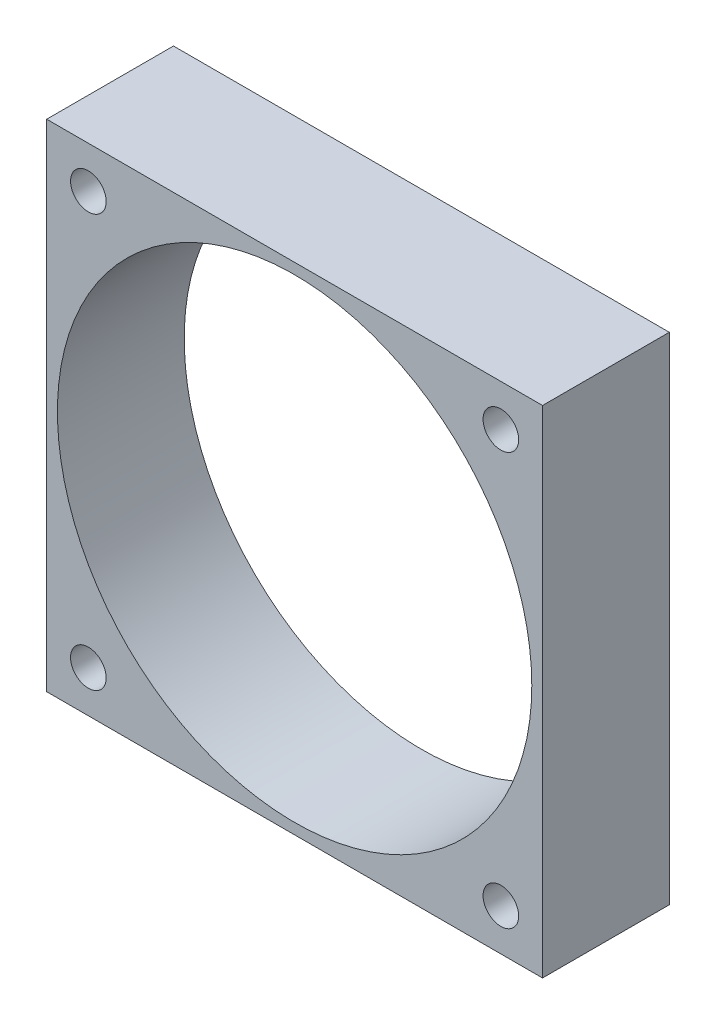
ISO-10303-21;
HEADER;
FILE_DESCRIPTION(('STEP AP214'),'2;1');
FILE_NAME('part.step','',(''),(''),'','','');
FILE_SCHEMA(('AUTOMOTIVE_DESIGN { 1 0 10303 214 1 1 1 1 }'));
ENDSEC;
DATA;
#1=APPLICATION_CONTEXT('core data for automotive mechanical design processes');
#2=APPLICATION_PROTOCOL_DEFINITION('international standard','automotive_design',2000,#1);
#3=PRODUCT_CONTEXT('',#1,'mechanical');
#4=PRODUCT('Part','Part','',(#3));
#5=PRODUCT_RELATED_PRODUCT_CATEGORY('part','',(#4));
#6=PRODUCT_DEFINITION_FORMATION('','',#4);
#7=PRODUCT_DEFINITION_CONTEXT('part definition',#1,'design');
#8=PRODUCT_DEFINITION('design','',#6,#7);
#9=PRODUCT_DEFINITION_SHAPE('','',#8);
#10=(LENGTH_UNIT() NAMED_UNIT(*) SI_UNIT(.MILLI.,.METRE.));
#11=(NAMED_UNIT(*) PLANE_ANGLE_UNIT() SI_UNIT($,.RADIAN.));
#12=(NAMED_UNIT(*) SI_UNIT($,.STERADIAN.) SOLID_ANGLE_UNIT());
#13=UNCERTAINTY_MEASURE_WITH_UNIT(LENGTH_MEASURE(1.E-05),#10,'distance_accuracy_value','');
#14=(GEOMETRIC_REPRESENTATION_CONTEXT(3) GLOBAL_UNCERTAINTY_ASSIGNED_CONTEXT((#13)) GLOBAL_UNIT_ASSIGNED_CONTEXT((#10,
#11,#12)) REPRESENTATION_CONTEXT('',''));
#15=CARTESIAN_POINT('',(0.,0.,0.));
#16=DIRECTION('',(0.,0.,1.));
#17=DIRECTION('',(1.,0.,0.));
#18=AXIS2_PLACEMENT_3D('',#15,#16,#17);
#19=CARTESIAN_POINT('',(0.,0.,15.367));
#20=DIRECTION('',(0.,0.,1.));
#21=DIRECTION('',(1.,0.,0.));
#22=AXIS2_PLACEMENT_3D('',#19,#20,#21);
#23=PLANE('',#22);
#24=CARTESIAN_POINT('',(-25.,-25.,15.367));
#25=DIRECTION('',(0.,0.,1.));
#26=DIRECTION('',(1.,0.,0.));
#27=AXIS2_PLACEMENT_3D('',#24,#25,#26);
#28=CIRCLE('',#27,2.159);
#29=CARTESIAN_POINT('',(-22.841,-25.,15.367));
#30=VERTEX_POINT('',#29);
#31=EDGE_CURVE('E127',#30,#30,#28,.T.);
#32=ORIENTED_EDGE('',*,*,#31,.F.);
#33=EDGE_LOOP('',(#32));
#34=FACE_BOUND('',#33,.T.);
#35=CARTESIAN_POINT('',(0.,0.,15.367));
#36=DIRECTION('',(0.,0.,1.));
#37=DIRECTION('',(1.,0.,0.));
#38=AXIS2_PLACEMENT_3D('',#35,#36,#37);
#39=CIRCLE('',#38,28.75);
#40=CARTESIAN_POINT('',(28.75,0.,15.367));
#41=VERTEX_POINT('',#40);
#42=EDGE_CURVE('E115',#41,#41,#39,.T.);
#43=ORIENTED_EDGE('',*,*,#42,.F.);
#44=EDGE_LOOP('',(#43));
#45=FACE_BOUND('',#44,.T.);
#46=DIRECTION('',(1.,0.,0.));
#47=VECTOR('',#46,1.);
#48=CARTESIAN_POINT('',(-30.05,-30.05,15.367));
#49=LINE('',#48,#47);
#50=CARTESIAN_POINT('',(-30.05,-30.05,15.367));
#51=VERTEX_POINT('',#50);
#52=CARTESIAN_POINT('',(30.05,-30.05,15.367));
#53=VERTEX_POINT('',#52);
#54=EDGE_CURVE('E85',#51,#53,#49,.T.);
#55=ORIENTED_EDGE('',*,*,#54,.T.);
#56=DIRECTION('',(0.,1.,0.));
#57=VECTOR('',#56,1.);
#58=CARTESIAN_POINT('',(30.05,-30.05,15.367));
#59=LINE('',#58,#57);
#60=CARTESIAN_POINT('',(30.05,30.05,15.367));
#61=VERTEX_POINT('',#60);
#62=EDGE_CURVE('E80',#53,#61,#59,.T.);
#63=ORIENTED_EDGE('',*,*,#62,.T.);
#64=DIRECTION('',(-1.,0.,0.));
#65=VECTOR('',#64,1.);
#66=CARTESIAN_POINT('',(-30.05,30.05,15.367));
#67=LINE('',#66,#65);
#68=CARTESIAN_POINT('',(-30.05,30.05,15.367));
#69=VERTEX_POINT('',#68);
#70=EDGE_CURVE('E83',#61,#69,#67,.T.);
#71=ORIENTED_EDGE('',*,*,#70,.T.);
#72=DIRECTION('',(0.,-1.,0.));
#73=VECTOR('',#72,1.);
#74=CARTESIAN_POINT('',(-30.05,-30.05,15.367));
#75=LINE('',#74,#73);
#76=EDGE_CURVE('E50',#69,#51,#75,.T.);
#77=ORIENTED_EDGE('',*,*,#76,.T.);
#78=EDGE_LOOP('',(#55,#63,#71,#77));
#79=FACE_BOUND('',#78,.T.);
#80=CARTESIAN_POINT('',(25.,25.,15.367));
#81=DIRECTION('',(0.,0.,1.));
#82=DIRECTION('',(1.,0.,0.));
#83=AXIS2_PLACEMENT_3D('',#80,#81,#82);
#84=CIRCLE('',#83,2.159);
#85=CARTESIAN_POINT('',(27.159,25.,15.367));
#86=VERTEX_POINT('',#85);
#87=EDGE_CURVE('E100',#86,#86,#84,.T.);
#88=ORIENTED_EDGE('',*,*,#87,.F.);
#89=EDGE_LOOP('',(#88));
#90=FACE_BOUND('',#89,.T.);
#91=CARTESIAN_POINT('',(25.,-25.,15.367));
#92=DIRECTION('',(0.,0.,1.));
#93=DIRECTION('',(1.,0.,0.));
#94=AXIS2_PLACEMENT_3D('',#91,#92,#93);
#95=CIRCLE('',#94,2.159);
#96=CARTESIAN_POINT('',(27.159,-25.,15.367));
#97=VERTEX_POINT('',#96);
#98=EDGE_CURVE('E121',#97,#97,#95,.T.);
#99=ORIENTED_EDGE('',*,*,#98,.F.);
#100=EDGE_LOOP('',(#99));
#101=FACE_BOUND('',#100,.T.);
#102=CARTESIAN_POINT('',(-25.,25.,15.367));
#103=DIRECTION('',(0.,0.,1.));
#104=DIRECTION('',(1.,0.,0.));
#105=AXIS2_PLACEMENT_3D('',#102,#103,#104);
#106=CIRCLE('',#105,2.159);
#107=CARTESIAN_POINT('',(-22.841,25.,15.367));
#108=VERTEX_POINT('',#107);
#109=EDGE_CURVE('E133',#108,#108,#106,.T.);
#110=ORIENTED_EDGE('',*,*,#109,.F.);
#111=EDGE_LOOP('',(#110));
#112=FACE_BOUND('',#111,.T.);
#113=ADVANCED_FACE('F33',(#34,#45,#79,#90,#101,#112),#23,.T.);
#114=CARTESIAN_POINT('',(0.,0.,0.));
#115=DIRECTION('',(0.,0.,1.));
#116=DIRECTION('',(1.,0.,0.));
#117=AXIS2_PLACEMENT_3D('',#114,#115,#116);
#118=PLANE('',#117);
#119=DIRECTION('',(1.,0.,0.));
#120=VECTOR('',#119,1.);
#121=CARTESIAN_POINT('',(-30.05,-30.05,0.));
#122=LINE('',#121,#120);
#123=CARTESIAN_POINT('',(-30.05,-30.05,0.));
#124=VERTEX_POINT('',#123);
#125=CARTESIAN_POINT('',(30.05,-30.05,0.));
#126=VERTEX_POINT('',#125);
#127=EDGE_CURVE('E97',#124,#126,#122,.T.);
#128=ORIENTED_EDGE('',*,*,#127,.F.);
#129=DIRECTION('',(0.,-1.,0.));
#130=VECTOR('',#129,1.);
#131=CARTESIAN_POINT('',(-30.05,-30.05,0.));
#132=LINE('',#131,#130);
#133=CARTESIAN_POINT('',(-30.05,30.05,0.));
#134=VERTEX_POINT('',#133);
#135=EDGE_CURVE('E73',#134,#124,#132,.T.);
#136=ORIENTED_EDGE('',*,*,#135,.F.);
#137=DIRECTION('',(-1.,0.,0.));
#138=VECTOR('',#137,1.);
#139=CARTESIAN_POINT('',(-30.05,30.05,0.));
#140=LINE('',#139,#138);
#141=CARTESIAN_POINT('',(30.05,30.05,0.));
#142=VERTEX_POINT('',#141);
#143=EDGE_CURVE('E67',#142,#134,#140,.T.);
#144=ORIENTED_EDGE('',*,*,#143,.F.);
#145=DIRECTION('',(0.,1.,0.));
#146=VECTOR('',#145,1.);
#147=CARTESIAN_POINT('',(30.05,-30.05,0.));
#148=LINE('',#147,#146);
#149=EDGE_CURVE('E89',#126,#142,#148,.T.);
#150=ORIENTED_EDGE('',*,*,#149,.F.);
#151=EDGE_LOOP('',(#128,#136,#144,#150));
#152=FACE_BOUND('',#151,.T.);
#153=CARTESIAN_POINT('',(25.,25.,0.));
#154=DIRECTION('',(0.,0.,1.));
#155=DIRECTION('',(1.,0.,0.));
#156=AXIS2_PLACEMENT_3D('',#153,#154,#155);
#157=CIRCLE('',#156,2.159);
#158=CARTESIAN_POINT('',(27.159,25.,0.));
#159=VERTEX_POINT('',#158);
#160=EDGE_CURVE('E112',#159,#159,#157,.T.);
#161=ORIENTED_EDGE('',*,*,#160,.T.);
#162=EDGE_LOOP('',(#161));
#163=FACE_BOUND('',#162,.T.);
#164=CARTESIAN_POINT('',(0.,0.,0.));
#165=DIRECTION('',(0.,0.,1.));
#166=DIRECTION('',(1.,0.,0.));
#167=AXIS2_PLACEMENT_3D('',#164,#165,#166);
#168=CIRCLE('',#167,28.75);
#169=CARTESIAN_POINT('',(28.75,0.,0.));
#170=VERTEX_POINT('',#169);
#171=EDGE_CURVE('E118',#170,#170,#168,.T.);
#172=ORIENTED_EDGE('',*,*,#171,.T.);
#173=EDGE_LOOP('',(#172));
#174=FACE_BOUND('',#173,.T.);
#175=CARTESIAN_POINT('',(25.,-25.,0.));
#176=DIRECTION('',(0.,0.,1.));
#177=DIRECTION('',(1.,0.,0.));
#178=AXIS2_PLACEMENT_3D('',#175,#176,#177);
#179=CIRCLE('',#178,2.159);
#180=CARTESIAN_POINT('',(27.159,-25.,0.));
#181=VERTEX_POINT('',#180);
#182=EDGE_CURVE('E124',#181,#181,#179,.T.);
#183=ORIENTED_EDGE('',*,*,#182,.T.);
#184=EDGE_LOOP('',(#183));
#185=FACE_BOUND('',#184,.T.);
#186=CARTESIAN_POINT('',(-25.,-25.,0.));
#187=DIRECTION('',(0.,0.,1.));
#188=DIRECTION('',(1.,0.,0.));
#189=AXIS2_PLACEMENT_3D('',#186,#187,#188);
#190=CIRCLE('',#189,2.159);
#191=CARTESIAN_POINT('',(-22.841,-25.,0.));
#192=VERTEX_POINT('',#191);
#193=EDGE_CURVE('E130',#192,#192,#190,.T.);
#194=ORIENTED_EDGE('',*,*,#193,.T.);
#195=EDGE_LOOP('',(#194));
#196=FACE_BOUND('',#195,.T.);
#197=CARTESIAN_POINT('',(-25.,25.,0.));
#198=DIRECTION('',(0.,0.,1.));
#199=DIRECTION('',(1.,0.,0.));
#200=AXIS2_PLACEMENT_3D('',#197,#198,#199);
#201=CIRCLE('',#200,2.159);
#202=CARTESIAN_POINT('',(-22.841,25.,0.));
#203=VERTEX_POINT('',#202);
#204=EDGE_CURVE('E136',#203,#203,#201,.T.);
#205=ORIENTED_EDGE('',*,*,#204,.T.);
#206=EDGE_LOOP('',(#205));
#207=FACE_BOUND('',#206,.T.);
#208=ADVANCED_FACE('F108',(#152,#163,#174,#185,#196,#207),#118,.F.);
#209=CARTESIAN_POINT('',(-30.05,-30.05,15.367));
#210=DIRECTION('',(0.,1.,0.));
#211=DIRECTION('',(0.,0.,1.));
#212=AXIS2_PLACEMENT_3D('',#209,#210,#211);
#213=PLANE('',#212);
#214=ORIENTED_EDGE('',*,*,#127,.T.);
#215=DIRECTION('',(0.,0.,-1.));
#216=VECTOR('',#215,1.);
#217=CARTESIAN_POINT('',(30.05,-30.05,15.367));
#218=LINE('',#217,#216);
#219=EDGE_CURVE('E11',#53,#126,#218,.T.);
#220=ORIENTED_EDGE('',*,*,#219,.F.);
#221=ORIENTED_EDGE('',*,*,#54,.F.);
#222=DIRECTION('',(0.,0.,-1.));
#223=VECTOR('',#222,1.);
#224=CARTESIAN_POINT('',(-30.05,-30.05,15.367));
#225=LINE('',#224,#223);
#226=EDGE_CURVE('E93',#51,#124,#225,.T.);
#227=ORIENTED_EDGE('',*,*,#226,.T.);
#228=EDGE_LOOP('',(#214,#220,#221,#227));
#229=FACE_BOUND('',#228,.T.);
#230=ADVANCED_FACE('F35',(#229),#213,.F.);
#231=CARTESIAN_POINT('',(30.05,-30.05,15.367));
#232=DIRECTION('',(-1.,0.,0.));
#233=DIRECTION('',(0.,0.,1.));
#234=AXIS2_PLACEMENT_3D('',#231,#232,#233);
#235=PLANE('',#234);
#236=ORIENTED_EDGE('',*,*,#149,.T.);
#237=DIRECTION('',(0.,0.,-1.));
#238=VECTOR('',#237,1.);
#239=CARTESIAN_POINT('',(30.05,30.05,15.367));
#240=LINE('',#239,#238);
#241=EDGE_CURVE('E42',#61,#142,#240,.T.);
#242=ORIENTED_EDGE('',*,*,#241,.F.);
#243=ORIENTED_EDGE('',*,*,#62,.F.);
#244=ORIENTED_EDGE('',*,*,#219,.T.);
#245=EDGE_LOOP('',(#236,#242,#243,#244));
#246=FACE_BOUND('',#245,.T.);
#247=ADVANCED_FACE('F88',(#246),#235,.F.);
#248=CARTESIAN_POINT('',(-30.05,30.05,15.367));
#249=DIRECTION('',(0.,-1.,0.));
#250=DIRECTION('',(0.,0.,-1.));
#251=AXIS2_PLACEMENT_3D('',#248,#249,#250);
#252=PLANE('',#251);
#253=ORIENTED_EDGE('',*,*,#143,.T.);
#254=DIRECTION('',(0.,0.,-1.));
#255=VECTOR('',#254,1.);
#256=CARTESIAN_POINT('',(-30.05,30.05,15.367));
#257=LINE('',#256,#255);
#258=EDGE_CURVE('E90',#69,#134,#257,.T.);
#259=ORIENTED_EDGE('',*,*,#258,.F.);
#260=ORIENTED_EDGE('',*,*,#70,.F.);
#261=ORIENTED_EDGE('',*,*,#241,.T.);
#262=EDGE_LOOP('',(#253,#259,#260,#261));
#263=FACE_BOUND('',#262,.T.);
#264=ADVANCED_FACE('F91',(#263),#252,.F.);
#265=CARTESIAN_POINT('',(-30.05,-30.05,15.367));
#266=DIRECTION('',(1.,0.,0.));
#267=DIRECTION('',(0.,0.,-1.));
#268=AXIS2_PLACEMENT_3D('',#265,#266,#267);
#269=PLANE('',#268);
#270=ORIENTED_EDGE('',*,*,#135,.T.);
#271=ORIENTED_EDGE('',*,*,#226,.F.);
#272=ORIENTED_EDGE('',*,*,#76,.F.);
#273=ORIENTED_EDGE('',*,*,#258,.T.);
#274=EDGE_LOOP('',(#270,#271,#272,#273));
#275=FACE_BOUND('',#274,.T.);
#276=ADVANCED_FACE('F105',(#275),#269,.F.);
#277=CARTESIAN_POINT('',(25.,25.,15.367));
#278=DIRECTION('',(0.,0.,-1.));
#279=DIRECTION('',(-1.,0.,0.));
#280=AXIS2_PLACEMENT_3D('',#277,#278,#279);
#281=CYLINDRICAL_SURFACE('',#280,2.159);
#282=ORIENTED_EDGE('',*,*,#87,.T.);
#283=EDGE_LOOP('',(#282));
#284=FACE_BOUND('',#283,.T.);
#285=ORIENTED_EDGE('',*,*,#160,.F.);
#286=EDGE_LOOP('',(#285));
#287=FACE_BOUND('',#286,.T.);
#288=ADVANCED_FACE('F155',(#284,#287),#281,.F.);
#289=CARTESIAN_POINT('',(0.,0.,15.367));
#290=DIRECTION('',(0.,0.,-1.));
#291=DIRECTION('',(-1.,0.,0.));
#292=AXIS2_PLACEMENT_3D('',#289,#290,#291);
#293=CYLINDRICAL_SURFACE('',#292,28.75);
#294=ORIENTED_EDGE('',*,*,#42,.T.);
#295=EDGE_LOOP('',(#294));
#296=FACE_BOUND('',#295,.T.);
#297=ORIENTED_EDGE('',*,*,#171,.F.);
#298=EDGE_LOOP('',(#297));
#299=FACE_BOUND('',#298,.T.);
#300=ADVANCED_FACE('F201',(#296,#299),#293,.F.);
#301=CARTESIAN_POINT('',(25.,-25.,15.367));
#302=DIRECTION('',(0.,0.,-1.));
#303=DIRECTION('',(-1.,0.,0.));
#304=AXIS2_PLACEMENT_3D('',#301,#302,#303);
#305=CYLINDRICAL_SURFACE('',#304,2.159);
#306=ORIENTED_EDGE('',*,*,#98,.T.);
#307=EDGE_LOOP('',(#306));
#308=FACE_BOUND('',#307,.T.);
#309=ORIENTED_EDGE('',*,*,#182,.F.);
#310=EDGE_LOOP('',(#309));
#311=FACE_BOUND('',#310,.T.);
#312=ADVANCED_FACE('F209',(#308,#311),#305,.F.);
#313=CARTESIAN_POINT('',(-25.,-25.,15.367));
#314=DIRECTION('',(0.,0.,-1.));
#315=DIRECTION('',(-1.,0.,0.));
#316=AXIS2_PLACEMENT_3D('',#313,#314,#315);
#317=CYLINDRICAL_SURFACE('',#316,2.159);
#318=ORIENTED_EDGE('',*,*,#31,.T.);
#319=EDGE_LOOP('',(#318));
#320=FACE_BOUND('',#319,.T.);
#321=ORIENTED_EDGE('',*,*,#193,.F.);
#322=EDGE_LOOP('',(#321));
#323=FACE_BOUND('',#322,.T.);
#324=ADVANCED_FACE('F217',(#320,#323),#317,.F.);
#325=CARTESIAN_POINT('',(-25.,25.,15.367));
#326=DIRECTION('',(0.,0.,-1.));
#327=DIRECTION('',(-1.,0.,0.));
#328=AXIS2_PLACEMENT_3D('',#325,#326,#327);
#329=CYLINDRICAL_SURFACE('',#328,2.159);
#330=ORIENTED_EDGE('',*,*,#109,.T.);
#331=EDGE_LOOP('',(#330));
#332=FACE_BOUND('',#331,.T.);
#333=ORIENTED_EDGE('',*,*,#204,.F.);
#334=EDGE_LOOP('',(#333));
#335=FACE_BOUND('',#334,.T.);
#336=ADVANCED_FACE('F142',(#332,#335),#329,.F.);
#337=CLOSED_SHELL('',(#113,#208,#230,#247,#264,#276,#288,#300,#312,#324,#336));
#338=MANIFOLD_SOLID_BREP('B2',#337);
#339=ADVANCED_BREP_SHAPE_REPRESENTATION('',(#18,#338),#14);
#340=SHAPE_DEFINITION_REPRESENTATION(#9,#339);
ENDSEC;
END-ISO-10303-21;
